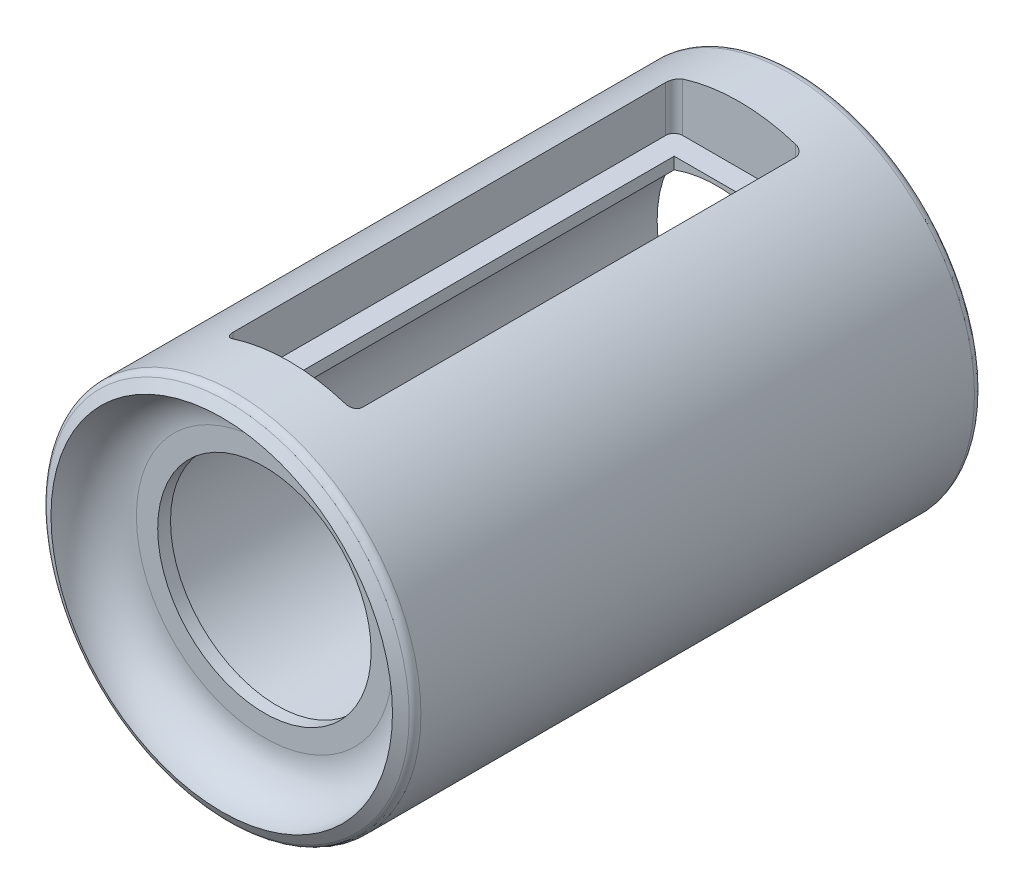
ISO-10303-21;
HEADER;
FILE_DESCRIPTION(('STEP AP214'),'2;1');
FILE_NAME('part.step','',(''),(''),'','','');
FILE_SCHEMA(('AUTOMOTIVE_DESIGN { 1 0 10303 214 1 1 1 1 }'));
ENDSEC;
DATA;
#1=APPLICATION_CONTEXT('core data for automotive mechanical design processes');
#2=APPLICATION_PROTOCOL_DEFINITION('international standard','automotive_design',2000,#1);
#3=PRODUCT_CONTEXT('',#1,'mechanical');
#4=PRODUCT('Part','Part','',(#3));
#5=PRODUCT_RELATED_PRODUCT_CATEGORY('part','',(#4));
#6=PRODUCT_DEFINITION_FORMATION('','',#4);
#7=PRODUCT_DEFINITION_CONTEXT('part definition',#1,'design');
#8=PRODUCT_DEFINITION('design','',#6,#7);
#9=PRODUCT_DEFINITION_SHAPE('','',#8);
#10=(LENGTH_UNIT() NAMED_UNIT(*) SI_UNIT(.MILLI.,.METRE.));
#11=(NAMED_UNIT(*) PLANE_ANGLE_UNIT() SI_UNIT($,.RADIAN.));
#12=(NAMED_UNIT(*) SI_UNIT($,.STERADIAN.) SOLID_ANGLE_UNIT());
#13=UNCERTAINTY_MEASURE_WITH_UNIT(LENGTH_MEASURE(1.E-05),#10,'distance_accuracy_value','');
#14=(GEOMETRIC_REPRESENTATION_CONTEXT(3) GLOBAL_UNCERTAINTY_ASSIGNED_CONTEXT((#13)) GLOBAL_UNIT_ASSIGNED_CONTEXT((#10,
#11,#12)) REPRESENTATION_CONTEXT('',''));
#15=CARTESIAN_POINT('',(0.,0.,0.));
#16=DIRECTION('',(0.,0.,1.));
#17=DIRECTION('',(1.,0.,0.));
#18=AXIS2_PLACEMENT_3D('',#15,#16,#17);
#19=CARTESIAN_POINT('',(0.,0.,64.012598628756));
#20=DIRECTION('',(0.,0.,-1.));
#21=DIRECTION('',(-1.,0.,0.));
#22=AXIS2_PLACEMENT_3D('',#19,#20,#21);
#23=CYLINDRICAL_SURFACE('',#22,31.75);
#24=CARTESIAN_POINT('',(0.,0.,-15.24));
#25=DIRECTION('',(0.,0.,1.));
#26=DIRECTION('',(1.,0.,0.));
#27=AXIS2_PLACEMENT_3D('',#24,#25,#26);
#28=CIRCLE('',#27,31.75);
#29=CARTESIAN_POINT('',(31.75,0.,-15.24));
#30=VERTEX_POINT('',#29);
#31=EDGE_CURVE('E11',#30,#30,#28,.T.);
#32=ORIENTED_EDGE('',*,*,#31,.T.);
#33=EDGE_LOOP('',(#32));
#34=FACE_BOUND('',#33,.T.);
#35=CARTESIAN_POINT('',(0.,0.,-19.05));
#36=DIRECTION('',(0.,0.,-1.));
#37=DIRECTION('',(-1.,0.,0.));
#38=AXIS2_PLACEMENT_3D('',#35,#36,#37);
#39=CIRCLE('',#38,31.75);
#40=CARTESIAN_POINT('',(-31.75,0.,-19.05));
#41=VERTEX_POINT('',#40);
#42=EDGE_CURVE('E23',#41,#41,#39,.F.);
#43=ORIENTED_EDGE('',*,*,#42,.F.);
#44=EDGE_LOOP('',(#43));
#45=FACE_BOUND('',#44,.T.);
#46=ADVANCED_FACE('F16',(#34,#45),#23,.F.);
#47=CARTESIAN_POINT('',(0.,38.1,-89.535));
#48=DIRECTION('',(0.,-1.,0.));
#49=DIRECTION('',(1.,0.,0.));
#50=AXIS2_PLACEMENT_3D('',#47,#48,#49);
#51=PLANE('',#50);
#52=DIRECTION('',(0.,0.,1.));
#53=VECTOR('',#52,1.);
#54=CARTESIAN_POINT('',(-19.304,38.1,-89.535));
#55=LINE('',#54,#53);
#56=CARTESIAN_POINT('',(-19.304,38.1,-153.924));
#57=VERTEX_POINT('',#56);
#58=CARTESIAN_POINT('',(-19.304,38.1,-25.146));
#59=VERTEX_POINT('',#58);
#60=EDGE_CURVE('E30',#57,#59,#55,.T.);
#61=ORIENTED_EDGE('',*,*,#60,.T.);
#62=CARTESIAN_POINT('',(-16.764,38.1,-25.146));
#63=DIRECTION('',(0.,-1.,0.));
#64=DIRECTION('',(0.,0.,-1.));
#65=AXIS2_PLACEMENT_3D('',#62,#63,#64);
#66=CIRCLE('',#65,2.54);
#67=CARTESIAN_POINT('',(-16.764,38.1,-22.606));
#68=VERTEX_POINT('',#67);
#69=EDGE_CURVE('E35',#59,#68,#66,.F.);
#70=ORIENTED_EDGE('',*,*,#69,.T.);
#71=DIRECTION('',(1.,0.,0.));
#72=VECTOR('',#71,1.);
#73=CARTESIAN_POINT('',(0.,38.1,-22.606));
#74=LINE('',#73,#72);
#75=CARTESIAN_POINT('',(16.764,38.1,-22.606));
#76=VERTEX_POINT('',#75);
#77=EDGE_CURVE('E278',#68,#76,#74,.T.);
#78=ORIENTED_EDGE('',*,*,#77,.T.);
#79=CARTESIAN_POINT('',(16.764,38.1,-25.146));
#80=DIRECTION('',(0.,-1.,0.));
#81=DIRECTION('',(0.,0.,-1.));
#82=AXIS2_PLACEMENT_3D('',#79,#80,#81);
#83=CIRCLE('',#82,2.54);
#84=CARTESIAN_POINT('',(19.304,38.1,-25.146));
#85=VERTEX_POINT('',#84);
#86=EDGE_CURVE('E276',#76,#85,#83,.F.);
#87=ORIENTED_EDGE('',*,*,#86,.T.);
#88=DIRECTION('',(0.,0.,-1.));
#89=VECTOR('',#88,1.);
#90=CARTESIAN_POINT('',(19.304,38.1,-89.535));
#91=LINE('',#90,#89);
#92=CARTESIAN_POINT('',(19.304,38.1,-153.924));
#93=VERTEX_POINT('',#92);
#94=EDGE_CURVE('E274',#85,#93,#91,.T.);
#95=ORIENTED_EDGE('',*,*,#94,.T.);
#96=CARTESIAN_POINT('',(16.764,38.1,-153.924));
#97=DIRECTION('',(0.,-1.,0.));
#98=DIRECTION('',(0.,0.,-1.));
#99=AXIS2_PLACEMENT_3D('',#96,#97,#98);
#100=CIRCLE('',#99,2.54);
#101=CARTESIAN_POINT('',(16.764,38.1,-156.464));
#102=VERTEX_POINT('',#101);
#103=EDGE_CURVE('E272',#93,#102,#100,.F.);
#104=ORIENTED_EDGE('',*,*,#103,.T.);
#105=DIRECTION('',(-1.,0.,0.));
#106=VECTOR('',#105,1.);
#107=CARTESIAN_POINT('',(0.,38.1,-156.464));
#108=LINE('',#107,#106);
#109=CARTESIAN_POINT('',(-16.764,38.1,-156.464));
#110=VERTEX_POINT('',#109);
#111=EDGE_CURVE('E270',#102,#110,#108,.T.);
#112=ORIENTED_EDGE('',*,*,#111,.T.);
#113=CARTESIAN_POINT('',(-16.764,38.1,-153.924));
#114=DIRECTION('',(0.,-1.,0.));
#115=DIRECTION('',(0.,0.,-1.));
#116=AXIS2_PLACEMENT_3D('',#113,#114,#115);
#117=CIRCLE('',#116,2.54);
#118=EDGE_CURVE('E268',#110,#57,#117,.F.);
#119=ORIENTED_EDGE('',*,*,#118,.T.);
#120=EDGE_LOOP('',(#61,#70,#78,#87,#95,#104,#112,#119));
#121=FACE_BOUND('',#120,.T.);
#122=DIRECTION('',(-1.,0.,0.));
#123=VECTOR('',#122,1.);
#124=CARTESIAN_POINT('',(6.35,38.1,-149.86));
#125=LINE('',#124,#123);
#126=CARTESIAN_POINT('',(12.7,38.1,-149.86));
#127=VERTEX_POINT('',#126);
#128=CARTESIAN_POINT('',(-12.7,38.1,-149.86));
#129=VERTEX_POINT('',#128);
#130=EDGE_CURVE('E265',#127,#129,#125,.T.);
#131=ORIENTED_EDGE('',*,*,#130,.F.);
#132=DIRECTION('',(0.,0.,-1.));
#133=VECTOR('',#132,1.);
#134=CARTESIAN_POINT('',(12.7,38.1,-89.535));
#135=LINE('',#134,#133);
#136=CARTESIAN_POINT('',(12.7,38.1,-29.21));
#137=VERTEX_POINT('',#136);
#138=EDGE_CURVE('E262',#137,#127,#135,.T.);
#139=ORIENTED_EDGE('',*,*,#138,.F.);
#140=DIRECTION('',(-1.,0.,0.));
#141=VECTOR('',#140,1.);
#142=CARTESIAN_POINT('',(6.35,38.1,-29.21));
#143=LINE('',#142,#141);
#144=CARTESIAN_POINT('',(-12.7,38.1,-29.21));
#145=VERTEX_POINT('',#144);
#146=EDGE_CURVE('E260',#137,#145,#143,.T.);
#147=ORIENTED_EDGE('',*,*,#146,.T.);
#148=DIRECTION('',(0.,0.,-1.));
#149=VECTOR('',#148,1.);
#150=CARTESIAN_POINT('',(-12.7,38.1,-89.535));
#151=LINE('',#150,#149);
#152=EDGE_CURVE('E122',#145,#129,#151,.T.);
#153=ORIENTED_EDGE('',*,*,#152,.T.);
#154=EDGE_LOOP('',(#131,#139,#147,#153));
#155=FACE_BOUND('',#154,.T.);
#156=ADVANCED_FACE('F204',(#121,#155),#51,.F.);
#157=CARTESIAN_POINT('',(0.,0.,-177.8));
#158=DIRECTION('',(0.,0.,1.));
#159=DIRECTION('',(1.,0.,0.));
#160=AXIS2_PLACEMENT_3D('',#157,#158,#159);
#161=CYLINDRICAL_SURFACE('',#160,55.245);
#162=CARTESIAN_POINT('',(0.,0.,-171.245980759903));
#163=DIRECTION('',(0.,0.,-1.));
#164=DIRECTION('',(-1.,0.,0.));
#165=AXIS2_PLACEMENT_3D('',#162,#163,#164);
#166=CIRCLE('',#165,55.245);
#167=CARTESIAN_POINT('',(-55.245,0.,-171.245980759903));
#168=VERTEX_POINT('',#167);
#169=EDGE_CURVE('E254',#168,#168,#166,.F.);
#170=ORIENTED_EDGE('',*,*,#169,.T.);
#171=EDGE_LOOP('',(#170));
#172=FACE_BOUND('',#171,.T.);
#173=CARTESIAN_POINT('',(0.,0.,-6.55401924009691));
#174=DIRECTION('',(0.,0.,1.));
#175=DIRECTION('',(1.,0.,0.));
#176=AXIS2_PLACEMENT_3D('',#173,#174,#175);
#177=CIRCLE('',#176,55.245);
#178=CARTESIAN_POINT('',(55.245,0.,-6.55401924009691));
#179=VERTEX_POINT('',#178);
#180=EDGE_CURVE('E250',#179,#179,#177,.F.);
#181=ORIENTED_EDGE('',*,*,#180,.T.);
#182=EDGE_LOOP('',(#181));
#183=FACE_BOUND('',#182,.T.);
#184=CARTESIAN_POINT('',(0.,0.,-22.606));
#185=DIRECTION('',(0.,0.,-1.));
#186=DIRECTION('',(-1.,0.,0.));
#187=AXIS2_PLACEMENT_3D('',#184,#185,#186);
#188=CIRCLE('',#187,55.245);
#189=CARTESIAN_POINT('',(-16.764,52.6400829121687,-22.606));
#190=VERTEX_POINT('',#189);
#191=CARTESIAN_POINT('',(16.764,52.6400829121688,-22.606));
#192=VERTEX_POINT('',#191);
#193=EDGE_CURVE('E246',#190,#192,#188,.T.);
#194=ORIENTED_EDGE('',*,*,#193,.F.);
#195=CARTESIAN_POINT('',(-16.764,52.6400829121687,-22.606));
#196=CARTESIAN_POINT('',(-16.8388096228046,52.6162596617696,-22.606002531707));
#197=CARTESIAN_POINT('',(-16.913530792499,52.5922867864362,-22.6093067336128));
#198=CARTESIAN_POINT('',(-17.062344250158,52.5441960113364,-22.622475094617));
#199=CARTESIAN_POINT('',(-17.1364365501252,52.5200781143529,-22.6323391282276));
#200=CARTESIAN_POINT('',(-17.3570280836911,52.4477592726947,-22.6716938876942));
#201=CARTESIAN_POINT('',(-17.5019123814329,52.399570729319,-22.7109473579558));
#202=CARTESIAN_POINT('',(-17.7830264068852,52.3048379399963,-22.8145480380259));
#203=CARTESIAN_POINT('',(-17.9192506064288,52.2582947526103,-22.8789110931228));
#204=CARTESIAN_POINT('',(-18.1789721210725,52.168514142307,-23.0312679211405));
#205=CARTESIAN_POINT('',(-18.3024745838249,52.1252753841463,-23.1192520837643));
#206=CARTESIAN_POINT('',(-18.5307717358418,52.0445478321751,-23.3150603134779));
#207=CARTESIAN_POINT('',(-18.6358566674979,52.0069714559042,-23.4225091546552));
#208=CARTESIAN_POINT('',(-18.8262496872433,51.9383540160342,-23.6555824473319));
#209=CARTESIAN_POINT('',(-18.9115582671963,51.907312789899,-23.7812064466651));
#210=CARTESIAN_POINT('',(-19.0550590060225,51.8548001763559,-24.0399355780512));
#211=CARTESIAN_POINT('',(-19.114447489123,51.8329092041942,-24.1722927285188));
#212=CARTESIAN_POINT('',(-19.2099583275316,51.7975883275488,-24.4461208683569));
#213=CARTESIAN_POINT('',(-19.2461164597655,51.784145412962,-24.5875774722432));
#214=CARTESIAN_POINT('',(-19.2812448751303,51.771070548156,-24.7996977623973));
#215=CARTESIAN_POINT('',(-19.2897740855641,51.7678924984682,-24.8686912261329));
#216=CARTESIAN_POINT('',(-19.301147901782,51.7636526483933,-25.0071105325224));
#217=CARTESIAN_POINT('',(-19.304000581348,51.7625878423262,-25.0765356199874));
#218=CARTESIAN_POINT('',(-19.304,51.7625888939106,-25.146));
#219=B_SPLINE_CURVE_WITH_KNOTS('',3,(#195,#196,#197,#198,#199,#200,#201,#202,#203,#204,#205,
#206,#207,#208,#209,#210,#211,#212,#213,#214,#215,#216,#217,#218),.UNSPECIFIED.,.F.,.F.,(4,2,2,
2,2,2,2,2,2,2,2,4),(0.,0.235387764561811,0.470771026345924,0.941318577098326,1.41216354629275,
1.88281724077186,2.34521227160225,2.80759580083043,3.24550405856602,3.6827362693711,
3.8912822383077,4.09953137778259),.UNSPECIFIED.);
#220=CARTESIAN_POINT('',(-19.304,51.7625888939106,-25.146));
#221=VERTEX_POINT('',#220);
#222=EDGE_CURVE('E212',#190,#221,#219,.T.);
#223=ORIENTED_EDGE('',*,*,#222,.T.);
#224=DIRECTION('',(0.,0.,1.));
#225=VECTOR('',#224,1.);
#226=CARTESIAN_POINT('',(-19.304,51.7625888939106,-177.8));
#227=LINE('',#226,#225);
#228=CARTESIAN_POINT('',(-19.304,51.7625888939106,-153.924));
#229=VERTEX_POINT('',#228);
#230=EDGE_CURVE('E242',#229,#221,#227,.T.);
#231=ORIENTED_EDGE('',*,*,#230,.F.);
#232=CARTESIAN_POINT('',(-19.304,51.7625888939106,-153.924));
#233=CARTESIAN_POINT('',(-19.3040090876376,51.7625844614717,-153.992321018454));
#234=CARTESIAN_POINT('',(-19.3012436159922,51.7636168154817,-154.060637145905));
#235=CARTESIAN_POINT('',(-19.2902335041183,51.7677214048707,-154.196751982984));
#236=CARTESIAN_POINT('',(-19.2819899167813,51.7707932482606,-154.264550789508));
#237=CARTESIAN_POINT('',(-19.260121750476,51.7789326242252,-154.398976165242));
#238=CARTESIAN_POINT('',(-19.2465111243033,51.7839949819241,-154.465605309797));
#239=CARTESIAN_POINT('',(-19.2140552019876,51.7960462319313,-154.59738005512));
#240=CARTESIAN_POINT('',(-19.1952098205827,51.8030351556187,-154.662525631705));
#241=CARTESIAN_POINT('',(-19.1310721806841,51.8267711460853,-154.855028501529));
#242=CARTESIAN_POINT('',(-19.0781533837089,51.8462968309674,-154.979603808565));
#243=CARTESIAN_POINT('',(-18.9539030287583,51.8918484436494,-155.217837797972));
#244=CARTESIAN_POINT('',(-18.8825647196309,51.9178767546897,-155.331492456685));
#245=CARTESIAN_POINT('',(-18.7214747554465,51.9761862125848,-155.548390774161));
#246=CARTESIAN_POINT('',(-18.631256376436,52.0086243865791,-155.651245535102));
#247=CARTESIAN_POINT('',(-18.436447163188,52.0780003752172,-155.840502378953));
#248=CARTESIAN_POINT('',(-18.3318520459276,52.1149395303901,-155.926899540554));
#249=CARTESIAN_POINT('',(-18.1046182028645,52.1943303348285,-156.086105026));
#250=CARTESIAN_POINT('',(-17.9812807004901,52.2369782905158,-156.157817908589));
#251=CARTESIAN_POINT('',(-17.7250198487902,52.3244878483769,-156.279452917713));
#252=CARTESIAN_POINT('',(-17.5920961847123,52.3693495232206,-156.329374328365));
#253=CARTESIAN_POINT('',(-17.3435958051302,52.4521089395058,-156.399752194987));
#254=CARTESIAN_POINT('',(-17.228977278277,52.4898744691277,-156.423803829495));
#255=CARTESIAN_POINT('',(-16.9976263015085,52.565252520474,-156.455930760474));
#256=CARTESIAN_POINT('',(-16.880896494415,52.6028651698619,-156.464024800725));
#257=CARTESIAN_POINT('',(-16.764,52.6400829121688,-156.464));
#258=B_SPLINE_CURVE_WITH_KNOTS('',3,(#232,#233,#234,#235,#236,#237,#238,#239,#240,#241,#242,
#243,#244,#245,#246,#247,#248,#249,#250,#251,#252,#253,#254,#255,#256,#257),.UNSPECIFIED.,.F.,
.F.,(4,2,2,2,2,2,2,2,2,2,2,2,4),(0.,0.204890924261534,0.409742479961084,0.614064953423867,
0.818390755018443,1.22658556462705,1.63493019942021,2.05490947256969,2.47501413544957,
2.91978033416475,3.36456114300557,3.73269177117235,4.10038973510181),.UNSPECIFIED.);
#259=CARTESIAN_POINT('',(-16.764,52.6400829121688,-156.464));
#260=VERTEX_POINT('',#259);
#261=EDGE_CURVE('E237',#229,#260,#258,.T.);
#262=ORIENTED_EDGE('',*,*,#261,.T.);
#263=CARTESIAN_POINT('',(0.,0.,-156.464));
#264=DIRECTION('',(0.,0.,1.));
#265=DIRECTION('',(1.,0.,0.));
#266=AXIS2_PLACEMENT_3D('',#263,#264,#265);
#267=CIRCLE('',#266,55.245);
#268=CARTESIAN_POINT('',(16.764,52.6400829121687,-156.464));
#269=VERTEX_POINT('',#268);
#270=EDGE_CURVE('E227',#269,#260,#267,.T.);
#271=ORIENTED_EDGE('',*,*,#270,.F.);
#272=CARTESIAN_POINT('',(16.764,52.6400829121688,-156.464));
#273=CARTESIAN_POINT('',(16.8388096228045,52.6162596617696,-156.463997468293));
#274=CARTESIAN_POINT('',(16.913530792499,52.5922867864362,-156.460693266387));
#275=CARTESIAN_POINT('',(17.062344250158,52.5441960113364,-156.447524905383));
#276=CARTESIAN_POINT('',(17.1364365501252,52.5200781143529,-156.437660871772));
#277=CARTESIAN_POINT('',(17.3570280836911,52.4477592726947,-156.398306112306));
#278=CARTESIAN_POINT('',(17.5019123814329,52.399570729319,-156.359052642044));
#279=CARTESIAN_POINT('',(17.7830264068852,52.3048379399963,-156.255451961974));
#280=CARTESIAN_POINT('',(17.9192506064288,52.2582947526103,-156.191088906877));
#281=CARTESIAN_POINT('',(18.1789721210725,52.168514142307,-156.038732078859));
#282=CARTESIAN_POINT('',(18.3024745838249,52.1252753841463,-155.950747916236));
#283=CARTESIAN_POINT('',(18.5307717358418,52.044547832175,-155.754939686522));
#284=CARTESIAN_POINT('',(18.6358566674979,52.0069714559042,-155.647490845345));
#285=CARTESIAN_POINT('',(18.8262496872433,51.9383540160342,-155.414417552668));
#286=CARTESIAN_POINT('',(18.9115582671963,51.9073127898991,-155.288793553335));
#287=CARTESIAN_POINT('',(19.0550590060225,51.8548001763559,-155.030064421949));
#288=CARTESIAN_POINT('',(19.114447489123,51.8329092041942,-154.897707271481));
#289=CARTESIAN_POINT('',(19.2099583275316,51.7975883275488,-154.623879131643));
#290=CARTESIAN_POINT('',(19.2461164597654,51.784145412962,-154.482422527757));
#291=CARTESIAN_POINT('',(19.2812448751302,51.771070548156,-154.270302237603));
#292=CARTESIAN_POINT('',(19.2897740855641,51.7678924984682,-154.201308773867));
#293=CARTESIAN_POINT('',(19.301147901782,51.7636526483933,-154.062889467478));
#294=CARTESIAN_POINT('',(19.304000581348,51.7625878423262,-153.993464380013));
#295=CARTESIAN_POINT('',(19.304,51.7625888939106,-153.924));
#296=B_SPLINE_CURVE_WITH_KNOTS('',3,(#272,#273,#274,#275,#276,#277,#278,#279,#280,#281,#282,
#283,#284,#285,#286,#287,#288,#289,#290,#291,#292,#293,#294,#295),.UNSPECIFIED.,.F.,.F.,(4,2,2,
2,2,2,2,2,2,2,2,4),(0.,0.235387764561799,0.470771026345937,0.941318577098317,1.41216354629277,
1.88281724077189,2.34521227160233,2.80759580083057,3.24550405856599,3.68273626937095,
3.89128223830764,4.09953137778264),.UNSPECIFIED.);
#297=CARTESIAN_POINT('',(19.304,51.7625888939106,-153.924));
#298=VERTEX_POINT('',#297);
#299=EDGE_CURVE('E221',#269,#298,#296,.T.);
#300=ORIENTED_EDGE('',*,*,#299,.T.);
#301=DIRECTION('',(0.,0.,1.));
#302=VECTOR('',#301,1.);
#303=CARTESIAN_POINT('',(19.304,51.7625888939106,-177.8));
#304=LINE('',#303,#302);
#305=CARTESIAN_POINT('',(19.304,51.7625888939106,-25.146));
#306=VERTEX_POINT('',#305);
#307=EDGE_CURVE('E193',#306,#298,#304,.F.);
#308=ORIENTED_EDGE('',*,*,#307,.F.);
#309=CARTESIAN_POINT('',(19.304,51.7625888939106,-25.146));
#310=CARTESIAN_POINT('',(19.3040090876376,51.7625844614717,-25.077678981546));
#311=CARTESIAN_POINT('',(19.3012436159922,51.7636168154817,-25.0093628540949));
#312=CARTESIAN_POINT('',(19.2902335041183,51.7677214048707,-24.8732480170163));
#313=CARTESIAN_POINT('',(19.2819899167813,51.7707932482606,-24.8054492104921));
#314=CARTESIAN_POINT('',(19.2601217504761,51.7789326242252,-24.671023834758));
#315=CARTESIAN_POINT('',(19.2465111243033,51.7839949819241,-24.604394690203));
#316=CARTESIAN_POINT('',(19.2140552019876,51.7960462319313,-24.4726199448801));
#317=CARTESIAN_POINT('',(19.1952098205827,51.8030351556187,-24.4074743682947));
#318=CARTESIAN_POINT('',(19.1310721806841,51.8267711460854,-24.2149714984715));
#319=CARTESIAN_POINT('',(19.078153383709,51.8462968309674,-24.0903961914348));
#320=CARTESIAN_POINT('',(18.9539030287584,51.8918484436494,-23.8521622020279));
#321=CARTESIAN_POINT('',(18.8825647196309,51.9178767546897,-23.7385075433148));
#322=CARTESIAN_POINT('',(18.7214747554464,51.9761862125848,-23.521609225839));
#323=CARTESIAN_POINT('',(18.631256376436,52.0086243865791,-23.4187544648977));
#324=CARTESIAN_POINT('',(18.436447163188,52.0780003752172,-23.229497621047));
#325=CARTESIAN_POINT('',(18.3318520459276,52.1149395303901,-23.1431004594458));
#326=CARTESIAN_POINT('',(18.1046182028645,52.1943303348285,-22.9838949740004));
#327=CARTESIAN_POINT('',(17.9812807004901,52.2369782905158,-22.9121820914108));
#328=CARTESIAN_POINT('',(17.7250198487902,52.3244878483768,-22.7905470822875));
#329=CARTESIAN_POINT('',(17.5920961847123,52.3693495232206,-22.7406256716357));
#330=CARTESIAN_POINT('',(17.3435958051301,52.4521089395058,-22.6702478050134));
#331=CARTESIAN_POINT('',(17.2289772782769,52.4898744691277,-22.6461961705053));
#332=CARTESIAN_POINT('',(16.9976263015085,52.565252520474,-22.6140692395262));
#333=CARTESIAN_POINT('',(16.880896494415,52.6028651698618,-22.605975199275));
#334=CARTESIAN_POINT('',(16.764,52.6400829121688,-22.606));
#335=B_SPLINE_CURVE_WITH_KNOTS('',3,(#309,#310,#311,#312,#313,#314,#315,#316,#317,#318,#319,
#320,#321,#322,#323,#324,#325,#326,#327,#328,#329,#330,#331,#332,#333,#334),.UNSPECIFIED.,.F.,
.F.,(4,2,2,2,2,2,2,2,2,2,2,2,4),(0.,0.204890924261489,0.409742479961042,0.614064953423774,
0.818390755018347,1.22658556462696,1.63493019942009,2.05490947256967,2.47501413544955,
2.91978033416468,3.36456114300546,3.7326917711723,4.10038973510175),.UNSPECIFIED.);
#336=EDGE_CURVE('E185',#306,#192,#335,.T.);
#337=ORIENTED_EDGE('',*,*,#336,.T.);
#338=EDGE_LOOP('',(#194,#223,#231,#262,#271,#300,#308,#337));
#339=FACE_BOUND('',#338,.T.);
#340=ADVANCED_FACE('F199',(#172,#183,#339),#161,.T.);
#341=CARTESIAN_POINT('',(0.,0.,-172.72));
#342=DIRECTION('',(0.,0.,1.));
#343=DIRECTION('',(1.,0.,0.));
#344=AXIS2_PLACEMENT_3D('',#341,#342,#343);
#345=CONICAL_SURFACE('',#344,55.245,1.05165021254837);
#346=CARTESIAN_POINT('',(0.,0.,-173.451318340899));
#347=DIRECTION('',(0.,0.,-1.));
#348=DIRECTION('',(-1.,0.,0.));
#349=AXIS2_PLACEMENT_3D('',#346,#347,#348);
#350=CIRCLE('',#349,53.9651929034264);
#351=CARTESIAN_POINT('',(-53.9651929034264,0.,-173.451318340899));
#352=VERTEX_POINT('',#351);
#353=EDGE_CURVE('E182',#352,#352,#350,.T.);
#354=ORIENTED_EDGE('',*,*,#353,.T.);
#355=EDGE_LOOP('',(#354));
#356=FACE_BOUND('',#355,.T.);
#357=CARTESIAN_POINT('',(0.,0.,-175.26));
#358=DIRECTION('',(0.,0.,-1.));
#359=DIRECTION('',(-1.,0.,0.));
#360=AXIS2_PLACEMENT_3D('',#357,#358,#359);
#361=CIRCLE('',#360,50.8);
#362=CARTESIAN_POINT('',(-50.8,0.,-175.26));
#363=VERTEX_POINT('',#362);
#364=EDGE_CURVE('E179',#363,#363,#361,.F.);
#365=ORIENTED_EDGE('',*,*,#364,.T.);
#366=EDGE_LOOP('',(#365));
#367=FACE_BOUND('',#366,.T.);
#368=ADVANCED_FACE('F203',(#356,#367),#345,.T.);
#369=CARTESIAN_POINT('',(0.,0.,0.));
#370=DIRECTION('',(0.,0.,-1.));
#371=DIRECTION('',(-1.,0.,0.));
#372=AXIS2_PLACEMENT_3D('',#369,#370,#371);
#373=CONICAL_SURFACE('',#372,46.355,1.05165021254837);
#374=CARTESIAN_POINT('',(0.,0.,-4.34868165910077));
#375=DIRECTION('',(0.,0.,1.));
#376=DIRECTION('',(1.,0.,0.));
#377=AXIS2_PLACEMENT_3D('',#374,#375,#376);
#378=CIRCLE('',#377,53.9651929034264);
#379=CARTESIAN_POINT('',(53.9651929034264,0.,-4.34868165910077));
#380=VERTEX_POINT('',#379);
#381=EDGE_CURVE('E176',#380,#380,#378,.T.);
#382=ORIENTED_EDGE('',*,*,#381,.T.);
#383=EDGE_LOOP('',(#382));
#384=FACE_BOUND('',#383,.T.);
#385=CARTESIAN_POINT('',(0.,0.,-2.54));
#386=DIRECTION('',(0.,0.,-1.));
#387=DIRECTION('',(-1.,0.,0.));
#388=AXIS2_PLACEMENT_3D('',#385,#386,#387);
#389=CIRCLE('',#388,50.8);
#390=CARTESIAN_POINT('',(-50.8,0.,-2.54));
#391=VERTEX_POINT('',#390);
#392=EDGE_CURVE('E173',#391,#391,#389,.F.);
#393=ORIENTED_EDGE('',*,*,#392,.F.);
#394=EDGE_LOOP('',(#393));
#395=FACE_BOUND('',#394,.T.);
#396=ADVANCED_FACE('F320',(#384,#395),#373,.T.);
#397=CARTESIAN_POINT('',(0.,0.,-6.55401924009691));
#398=DIRECTION('',(0.,0.,1.));
#399=DIRECTION('',(1.,0.,0.));
#400=AXIS2_PLACEMENT_3D('',#397,#398,#399);
#401=TOROIDAL_SURFACE('',#400,52.705,2.54);
#402=ORIENTED_EDGE('',*,*,#381,.F.);
#403=EDGE_LOOP('',(#402));
#404=FACE_BOUND('',#403,.T.);
#405=ORIENTED_EDGE('',*,*,#180,.F.);
#406=EDGE_LOOP('',(#405));
#407=FACE_BOUND('',#406,.T.);
#408=ADVANCED_FACE('F316',(#404,#407),#401,.T.);
#409=CARTESIAN_POINT('',(0.,0.,-171.245980759903));
#410=DIRECTION('',(0.,0.,-1.));
#411=DIRECTION('',(-1.,0.,0.));
#412=AXIS2_PLACEMENT_3D('',#409,#410,#411);
#413=TOROIDAL_SURFACE('',#412,52.705,2.54);
#414=ORIENTED_EDGE('',*,*,#353,.F.);
#415=EDGE_LOOP('',(#414));
#416=FACE_BOUND('',#415,.T.);
#417=ORIENTED_EDGE('',*,*,#169,.F.);
#418=EDGE_LOOP('',(#417));
#419=FACE_BOUND('',#418,.T.);
#420=ADVANCED_FACE('F298',(#416,#419),#413,.T.);
#421=CARTESIAN_POINT('',(0.,0.,-15.24));
#422=DIRECTION('',(0.,0.,1.));
#423=DIRECTION('',(1.,0.,0.));
#424=AXIS2_PLACEMENT_3D('',#421,#422,#423);
#425=PLANE('',#424);
#426=ORIENTED_EDGE('',*,*,#31,.F.);
#427=EDGE_LOOP('',(#426));
#428=FACE_BOUND('',#427,.T.);
#429=CARTESIAN_POINT('',(0.,0.,-15.24));
#430=DIRECTION('',(0.,0.,1.));
#431=DIRECTION('',(1.,0.,0.));
#432=AXIS2_PLACEMENT_3D('',#429,#430,#431);
#433=CIRCLE('',#432,38.1);
#434=CARTESIAN_POINT('',(38.1,0.,-15.24));
#435=VERTEX_POINT('',#434);
#436=EDGE_CURVE('E170',#435,#435,#433,.T.);
#437=ORIENTED_EDGE('',*,*,#436,.T.);
#438=EDGE_LOOP('',(#437));
#439=FACE_BOUND('',#438,.T.);
#440=ADVANCED_FACE('F294',(#428,#439),#425,.T.);
#441=CARTESIAN_POINT('',(0.,0.,-2.54));
#442=DIRECTION('',(0.,0.,1.));
#443=DIRECTION('',(1.,0.,0.));
#444=AXIS2_PLACEMENT_3D('',#441,#442,#443);
#445=TOROIDAL_SURFACE('',#444,38.1,12.7);
#446=ORIENTED_EDGE('',*,*,#392,.T.);
#447=EDGE_LOOP('',(#446));
#448=FACE_BOUND('',#447,.T.);
#449=ORIENTED_EDGE('',*,*,#436,.F.);
#450=EDGE_LOOP('',(#449));
#451=FACE_BOUND('',#450,.T.);
#452=ADVANCED_FACE('F297',(#448,#451),#445,.F.);
#453=CARTESIAN_POINT('',(-19.304,55.247,-89.535));
#454=DIRECTION('',(1.,0.,0.));
#455=DIRECTION('',(0.,0.,-1.));
#456=AXIS2_PLACEMENT_3D('',#453,#454,#455);
#457=PLANE('',#456);
#458=ORIENTED_EDGE('',*,*,#230,.T.);
#459=DIRECTION('',(0.,-1.,0.));
#460=VECTOR('',#459,1.);
#461=CARTESIAN_POINT('',(-19.304,38.1,-25.146));
#462=LINE('',#461,#460);
#463=EDGE_CURVE('E168',#221,#59,#462,.T.);
#464=ORIENTED_EDGE('',*,*,#463,.T.);
#465=ORIENTED_EDGE('',*,*,#60,.F.);
#466=DIRECTION('',(0.,-1.,0.));
#467=VECTOR('',#466,1.);
#468=CARTESIAN_POINT('',(-19.304,51.7625888939106,-153.924));
#469=LINE('',#468,#467);
#470=EDGE_CURVE('E165',#57,#229,#469,.F.);
#471=ORIENTED_EDGE('',*,*,#470,.T.);
#472=EDGE_LOOP('',(#458,#464,#465,#471));
#473=FACE_BOUND('',#472,.T.);
#474=ADVANCED_FACE('F303',(#473),#457,.T.);
#475=CARTESIAN_POINT('',(0.,55.247,-22.606));
#476=DIRECTION('',(0.,0.,-1.));
#477=DIRECTION('',(-1.,0.,0.));
#478=AXIS2_PLACEMENT_3D('',#475,#476,#477);
#479=PLANE('',#478);
#480=ORIENTED_EDGE('',*,*,#77,.F.);
#481=DIRECTION('',(0.,-1.,0.));
#482=VECTOR('',#481,1.);
#483=CARTESIAN_POINT('',(-16.764,51.7625888939106,-22.606));
#484=LINE('',#483,#482);
#485=EDGE_CURVE('E162',#68,#190,#484,.F.);
#486=ORIENTED_EDGE('',*,*,#485,.T.);
#487=ORIENTED_EDGE('',*,*,#193,.T.);
#488=DIRECTION('',(0.,-1.,0.));
#489=VECTOR('',#488,1.);
#490=CARTESIAN_POINT('',(16.764,38.1,-22.606));
#491=LINE('',#490,#489);
#492=EDGE_CURVE('E159',#192,#76,#491,.T.);
#493=ORIENTED_EDGE('',*,*,#492,.T.);
#494=EDGE_LOOP('',(#480,#486,#487,#493));
#495=FACE_BOUND('',#494,.T.);
#496=ADVANCED_FACE('F310',(#495),#479,.T.);
#497=CARTESIAN_POINT('',(19.304,55.247,-89.535));
#498=DIRECTION('',(-1.,0.,0.));
#499=DIRECTION('',(0.,0.,1.));
#500=AXIS2_PLACEMENT_3D('',#497,#498,#499);
#501=PLANE('',#500);
#502=ORIENTED_EDGE('',*,*,#94,.F.);
#503=DIRECTION('',(0.,-1.,0.));
#504=VECTOR('',#503,1.);
#505=CARTESIAN_POINT('',(19.304,51.7625888939106,-25.146));
#506=LINE('',#505,#504);
#507=EDGE_CURVE('E156',#85,#306,#506,.F.);
#508=ORIENTED_EDGE('',*,*,#507,.T.);
#509=ORIENTED_EDGE('',*,*,#307,.T.);
#510=DIRECTION('',(0.,-1.,0.));
#511=VECTOR('',#510,1.);
#512=CARTESIAN_POINT('',(19.304,38.1,-153.924));
#513=LINE('',#512,#511);
#514=EDGE_CURVE('E153',#298,#93,#513,.T.);
#515=ORIENTED_EDGE('',*,*,#514,.T.);
#516=EDGE_LOOP('',(#502,#508,#509,#515));
#517=FACE_BOUND('',#516,.T.);
#518=ADVANCED_FACE('F347',(#517),#501,.T.);
#519=CARTESIAN_POINT('',(0.,55.247,-156.464));
#520=DIRECTION('',(0.,0.,1.));
#521=DIRECTION('',(1.,0.,0.));
#522=AXIS2_PLACEMENT_3D('',#519,#520,#521);
#523=PLANE('',#522);
#524=ORIENTED_EDGE('',*,*,#111,.F.);
#525=DIRECTION('',(0.,-1.,0.));
#526=VECTOR('',#525,1.);
#527=CARTESIAN_POINT('',(16.764,51.7625888939106,-156.464));
#528=LINE('',#527,#526);
#529=EDGE_CURVE('E150',#102,#269,#528,.F.);
#530=ORIENTED_EDGE('',*,*,#529,.T.);
#531=ORIENTED_EDGE('',*,*,#270,.T.);
#532=DIRECTION('',(0.,-1.,0.));
#533=VECTOR('',#532,1.);
#534=CARTESIAN_POINT('',(-16.764,38.1,-156.464));
#535=LINE('',#534,#533);
#536=EDGE_CURVE('E147',#260,#110,#535,.T.);
#537=ORIENTED_EDGE('',*,*,#536,.T.);
#538=EDGE_LOOP('',(#524,#530,#531,#537));
#539=FACE_BOUND('',#538,.T.);
#540=ADVANCED_FACE('F344',(#539),#523,.T.);
#541=CARTESIAN_POINT('',(-16.764,55.247,-25.146));
#542=DIRECTION('',(0.,1.,0.));
#543=DIRECTION('',(0.,0.,1.));
#544=AXIS2_PLACEMENT_3D('',#541,#542,#543);
#545=CYLINDRICAL_SURFACE('',#544,2.54);
#546=ORIENTED_EDGE('',*,*,#222,.F.);
#547=ORIENTED_EDGE('',*,*,#485,.F.);
#548=ORIENTED_EDGE('',*,*,#69,.F.);
#549=ORIENTED_EDGE('',*,*,#463,.F.);
#550=EDGE_LOOP('',(#546,#547,#548,#549));
#551=FACE_BOUND('',#550,.T.);
#552=ADVANCED_FACE('F206',(#551),#545,.F.);
#553=CARTESIAN_POINT('',(16.764,55.247,-25.146));
#554=DIRECTION('',(0.,1.,0.));
#555=DIRECTION('',(0.,0.,1.));
#556=AXIS2_PLACEMENT_3D('',#553,#554,#555);
#557=CYLINDRICAL_SURFACE('',#556,2.54);
#558=ORIENTED_EDGE('',*,*,#336,.F.);
#559=ORIENTED_EDGE('',*,*,#507,.F.);
#560=ORIENTED_EDGE('',*,*,#86,.F.);
#561=ORIENTED_EDGE('',*,*,#492,.F.);
#562=EDGE_LOOP('',(#558,#559,#560,#561));
#563=FACE_BOUND('',#562,.T.);
#564=ADVANCED_FACE('F195',(#563),#557,.F.);
#565=CARTESIAN_POINT('',(16.764,55.247,-153.924));
#566=DIRECTION('',(0.,1.,0.));
#567=DIRECTION('',(0.,0.,1.));
#568=AXIS2_PLACEMENT_3D('',#565,#566,#567);
#569=CYLINDRICAL_SURFACE('',#568,2.54);
#570=ORIENTED_EDGE('',*,*,#299,.F.);
#571=ORIENTED_EDGE('',*,*,#529,.F.);
#572=ORIENTED_EDGE('',*,*,#103,.F.);
#573=ORIENTED_EDGE('',*,*,#514,.F.);
#574=EDGE_LOOP('',(#570,#571,#572,#573));
#575=FACE_BOUND('',#574,.T.);
#576=ADVANCED_FACE('F228',(#575),#569,.F.);
#577=CARTESIAN_POINT('',(-16.764,55.247,-153.924));
#578=DIRECTION('',(0.,1.,0.));
#579=DIRECTION('',(0.,0.,1.));
#580=AXIS2_PLACEMENT_3D('',#577,#578,#579);
#581=CYLINDRICAL_SURFACE('',#580,2.54);
#582=ORIENTED_EDGE('',*,*,#261,.F.);
#583=ORIENTED_EDGE('',*,*,#470,.F.);
#584=ORIENTED_EDGE('',*,*,#118,.F.);
#585=ORIENTED_EDGE('',*,*,#536,.F.);
#586=EDGE_LOOP('',(#582,#583,#584,#585));
#587=FACE_BOUND('',#586,.T.);
#588=ADVANCED_FACE('F231',(#587),#581,.F.);
#589=CARTESIAN_POINT('',(0.,0.,-168.91));
#590=DIRECTION('',(0.,0.,-1.));
#591=DIRECTION('',(-1.,0.,0.));
#592=AXIS2_PLACEMENT_3D('',#589,#590,#591);
#593=CYLINDRICAL_SURFACE('',#592,50.8);
#594=CARTESIAN_POINT('',(0.,0.,-168.91));
#595=DIRECTION('',(0.,0.,-1.));
#596=DIRECTION('',(-1.,0.,0.));
#597=AXIS2_PLACEMENT_3D('',#594,#595,#596);
#598=CIRCLE('',#597,50.8);
#599=CARTESIAN_POINT('',(-50.8,0.,-168.91));
#600=VERTEX_POINT('',#599);
#601=EDGE_CURVE('E144',#600,#600,#598,.F.);
#602=ORIENTED_EDGE('',*,*,#601,.T.);
#603=EDGE_LOOP('',(#602));
#604=FACE_BOUND('',#603,.T.);
#605=ORIENTED_EDGE('',*,*,#364,.F.);
#606=EDGE_LOOP('',(#605));
#607=FACE_BOUND('',#606,.T.);
#608=ADVANCED_FACE('F235',(#604,#607),#593,.F.);
#609=CARTESIAN_POINT('',(0.,0.,-168.91));
#610=DIRECTION('',(0.,0.,-1.));
#611=DIRECTION('',(1.,0.,0.));
#612=AXIS2_PLACEMENT_3D('',#609,#610,#611);
#613=PLANE('',#612);
#614=CARTESIAN_POINT('',(0.,0.,-168.91));
#615=DIRECTION('',(0.,0.,-1.));
#616=DIRECTION('',(-1.,0.,0.));
#617=AXIS2_PLACEMENT_3D('',#614,#615,#616);
#618=CIRCLE('',#617,36.83);
#619=CARTESIAN_POINT('',(-36.83,0.,-168.91));
#620=VERTEX_POINT('',#619);
#621=EDGE_CURVE('E141',#620,#620,#618,.T.);
#622=ORIENTED_EDGE('',*,*,#621,.F.);
#623=EDGE_LOOP('',(#622));
#624=FACE_BOUND('',#623,.T.);
#625=ORIENTED_EDGE('',*,*,#601,.F.);
#626=EDGE_LOOP('',(#625));
#627=FACE_BOUND('',#626,.T.);
#628=ADVANCED_FACE('F333',(#624,#627),#613,.T.);
#629=CARTESIAN_POINT('',(6.35,38.1,-149.86));
#630=DIRECTION('',(0.,0.,1.));
#631=DIRECTION('',(1.,0.,0.));
#632=AXIS2_PLACEMENT_3D('',#629,#630,#631);
#633=PLANE('',#632);
#634=CARTESIAN_POINT('',(0.,0.,-149.86));
#635=DIRECTION('',(0.,0.,1.));
#636=DIRECTION('',(1.,0.,0.));
#637=AXIS2_PLACEMENT_3D('',#634,#635,#636);
#638=CIRCLE('',#637,36.83);
#639=CARTESIAN_POINT('',(12.7,34.5710702755931,-149.86));
#640=VERTEX_POINT('',#639);
#641=CARTESIAN_POINT('',(-12.7,34.5710702755932,-149.86));
#642=VERTEX_POINT('',#641);
#643=EDGE_CURVE('E126',#640,#642,#638,.T.);
#644=ORIENTED_EDGE('',*,*,#643,.F.);
#645=DIRECTION('',(0.,-1.,0.));
#646=VECTOR('',#645,1.);
#647=CARTESIAN_POINT('',(12.7,38.1,-149.86));
#648=LINE('',#647,#646);
#649=EDGE_CURVE('E137',#127,#640,#648,.T.);
#650=ORIENTED_EDGE('',*,*,#649,.F.);
#651=ORIENTED_EDGE('',*,*,#130,.T.);
#652=DIRECTION('',(0.,-1.,0.));
#653=VECTOR('',#652,1.);
#654=CARTESIAN_POINT('',(-12.7,38.1,-149.86));
#655=LINE('',#654,#653);
#656=EDGE_CURVE('E135',#129,#642,#655,.T.);
#657=ORIENTED_EDGE('',*,*,#656,.T.);
#658=EDGE_LOOP('',(#644,#650,#651,#657));
#659=FACE_BOUND('',#658,.T.);
#660=ADVANCED_FACE('F339',(#659),#633,.T.);
#661=CARTESIAN_POINT('',(12.7,38.1,-89.535));
#662=DIRECTION('',(-1.,0.,0.));
#663=DIRECTION('',(0.,0.,1.));
#664=AXIS2_PLACEMENT_3D('',#661,#662,#663);
#665=PLANE('',#664);
#666=DIRECTION('',(0.,0.,-1.));
#667=VECTOR('',#666,1.);
#668=CARTESIAN_POINT('',(12.7,34.5710702755931,-19.05));
#669=LINE('',#668,#667);
#670=CARTESIAN_POINT('',(12.7,34.5710702755932,-29.21));
#671=VERTEX_POINT('',#670);
#672=EDGE_CURVE('E133',#671,#640,#669,.T.);
#673=ORIENTED_EDGE('',*,*,#672,.F.);
#674=DIRECTION('',(0.,-1.,0.));
#675=VECTOR('',#674,1.);
#676=CARTESIAN_POINT('',(12.7,38.1,-29.21));
#677=LINE('',#676,#675);
#678=EDGE_CURVE('E111',#137,#671,#677,.T.);
#679=ORIENTED_EDGE('',*,*,#678,.F.);
#680=ORIENTED_EDGE('',*,*,#138,.T.);
#681=ORIENTED_EDGE('',*,*,#649,.T.);
#682=EDGE_LOOP('',(#673,#679,#680,#681));
#683=FACE_BOUND('',#682,.T.);
#684=ADVANCED_FACE('F376',(#683),#665,.T.);
#685=CARTESIAN_POINT('',(6.35,38.1,-29.21));
#686=DIRECTION('',(0.,0.,1.));
#687=DIRECTION('',(1.,0.,0.));
#688=AXIS2_PLACEMENT_3D('',#685,#686,#687);
#689=PLANE('',#688);
#690=ORIENTED_EDGE('',*,*,#678,.T.);
#691=CARTESIAN_POINT('',(0.,0.,-29.21));
#692=DIRECTION('',(0.,0.,1.));
#693=DIRECTION('',(1.,0.,0.));
#694=AXIS2_PLACEMENT_3D('',#691,#692,#693);
#695=CIRCLE('',#694,36.83);
#696=CARTESIAN_POINT('',(-12.7,34.5710702755932,-29.21));
#697=VERTEX_POINT('',#696);
#698=EDGE_CURVE('E104',#671,#697,#695,.T.);
#699=ORIENTED_EDGE('',*,*,#698,.T.);
#700=DIRECTION('',(0.,-1.,0.));
#701=VECTOR('',#700,1.);
#702=CARTESIAN_POINT('',(-12.7,38.1,-29.21));
#703=LINE('',#702,#701);
#704=EDGE_CURVE('E108',#145,#697,#703,.T.);
#705=ORIENTED_EDGE('',*,*,#704,.F.);
#706=ORIENTED_EDGE('',*,*,#146,.F.);
#707=EDGE_LOOP('',(#690,#699,#705,#706));
#708=FACE_BOUND('',#707,.T.);
#709=ADVANCED_FACE('F106',(#708),#689,.F.);
#710=CARTESIAN_POINT('',(-12.7,38.1,-89.535));
#711=DIRECTION('',(-1.,0.,0.));
#712=DIRECTION('',(0.,0.,1.));
#713=AXIS2_PLACEMENT_3D('',#710,#711,#712);
#714=PLANE('',#713);
#715=ORIENTED_EDGE('',*,*,#704,.T.);
#716=DIRECTION('',(0.,0.,-1.));
#717=VECTOR('',#716,1.);
#718=CARTESIAN_POINT('',(-12.7,34.5710702755932,-19.05));
#719=LINE('',#718,#717);
#720=EDGE_CURVE('E120',#697,#642,#719,.T.);
#721=ORIENTED_EDGE('',*,*,#720,.T.);
#722=ORIENTED_EDGE('',*,*,#656,.F.);
#723=ORIENTED_EDGE('',*,*,#152,.F.);
#724=EDGE_LOOP('',(#715,#721,#722,#723));
#725=FACE_BOUND('',#724,.T.);
#726=ADVANCED_FACE('F118',(#725),#714,.F.);
#727=CARTESIAN_POINT('',(0.,0.,-19.05));
#728=DIRECTION('',(0.,0.,-1.));
#729=DIRECTION('',(1.,0.,0.));
#730=AXIS2_PLACEMENT_3D('',#727,#728,#729);
#731=PLANE('',#730);
#732=CARTESIAN_POINT('',(0.,0.,-19.05));
#733=DIRECTION('',(0.,0.,-1.));
#734=DIRECTION('',(-1.,0.,0.));
#735=AXIS2_PLACEMENT_3D('',#732,#733,#734);
#736=CIRCLE('',#735,36.83);
#737=CARTESIAN_POINT('',(-36.83,0.,-19.05));
#738=VERTEX_POINT('',#737);
#739=EDGE_CURVE('E127',#738,#738,#736,.T.);
#740=ORIENTED_EDGE('',*,*,#739,.T.);
#741=EDGE_LOOP('',(#740));
#742=FACE_BOUND('',#741,.T.);
#743=ORIENTED_EDGE('',*,*,#42,.T.);
#744=EDGE_LOOP('',(#743));
#745=FACE_BOUND('',#744,.T.);
#746=ADVANCED_FACE('F284',(#742,#745),#731,.T.);
#747=CARTESIAN_POINT('',(0.,0.,-19.05));
#748=DIRECTION('',(0.,0.,-1.));
#749=DIRECTION('',(-1.,0.,0.));
#750=AXIS2_PLACEMENT_3D('',#747,#748,#749);
#751=CYLINDRICAL_SURFACE('',#750,36.83);
#752=ORIENTED_EDGE('',*,*,#643,.T.);
#753=ORIENTED_EDGE('',*,*,#720,.F.);
#754=ORIENTED_EDGE('',*,*,#698,.F.);
#755=ORIENTED_EDGE('',*,*,#672,.T.);
#756=EDGE_LOOP('',(#752,#753,#754,#755));
#757=FACE_BOUND('',#756,.T.);
#758=ORIENTED_EDGE('',*,*,#739,.F.);
#759=EDGE_LOOP('',(#758));
#760=FACE_BOUND('',#759,.T.);
#761=ORIENTED_EDGE('',*,*,#621,.T.);
#762=EDGE_LOOP('',(#761));
#763=FACE_BOUND('',#762,.T.);
#764=ADVANCED_FACE('F124',(#757,#760,#763),#751,.F.);
#765=CLOSED_SHELL('',(#46,#156,#340,#368,#396,#408,#420,#440,#452,#474,#496,#518,#540,#552,#564,
#576,#588,#608,#628,#660,#684,#709,#726,#746,#764));
#766=MANIFOLD_SOLID_BREP('B1',#765);
#767=ADVANCED_BREP_SHAPE_REPRESENTATION('',(#18,#766),#14);
#768=SHAPE_DEFINITION_REPRESENTATION(#9,#767);
ENDSEC;
END-ISO-10303-21;
